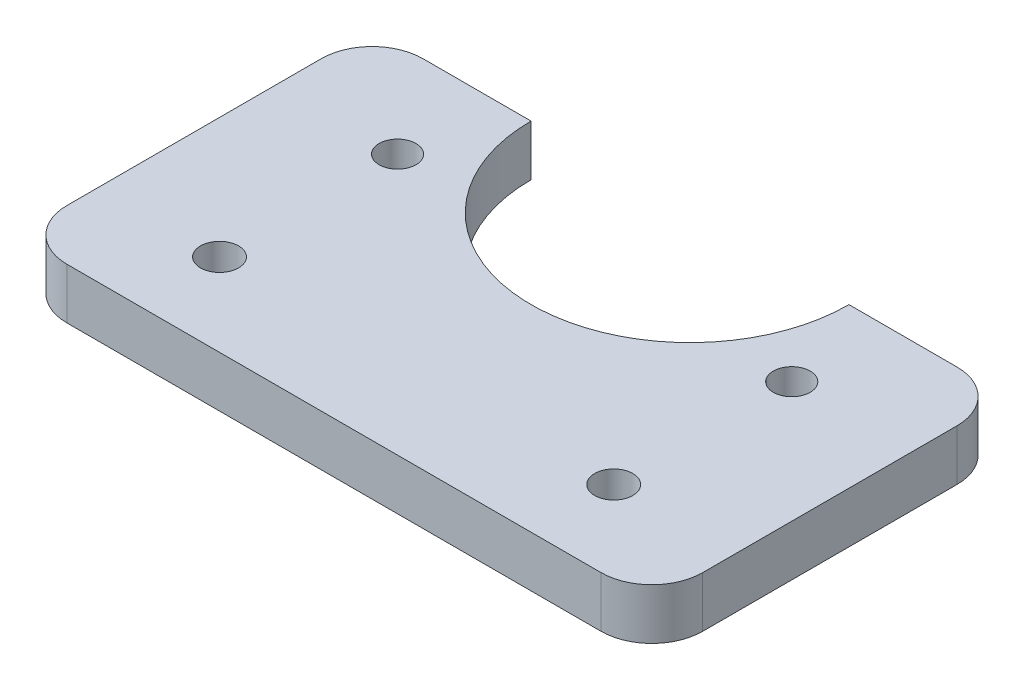
ISO-10303-21;
HEADER;
FILE_DESCRIPTION(('STEP AP214'),'2;1');
FILE_NAME('part.step','',(''),(''),'','','');
FILE_SCHEMA(('AUTOMOTIVE_DESIGN { 1 0 10303 214 1 1 1 1 }'));
ENDSEC;
DATA;
#1=APPLICATION_CONTEXT('core data for automotive mechanical design processes');
#2=APPLICATION_PROTOCOL_DEFINITION('international standard','automotive_design',2000,#1);
#3=PRODUCT_CONTEXT('',#1,'mechanical');
#4=PRODUCT('Part','Part','',(#3));
#5=PRODUCT_RELATED_PRODUCT_CATEGORY('part','',(#4));
#6=PRODUCT_DEFINITION_FORMATION('','',#4);
#7=PRODUCT_DEFINITION_CONTEXT('part definition',#1,'design');
#8=PRODUCT_DEFINITION('design','',#6,#7);
#9=PRODUCT_DEFINITION_SHAPE('','',#8);
#10=(LENGTH_UNIT() NAMED_UNIT(*) SI_UNIT(.MILLI.,.METRE.));
#11=(NAMED_UNIT(*) PLANE_ANGLE_UNIT() SI_UNIT($,.RADIAN.));
#12=(NAMED_UNIT(*) SI_UNIT($,.STERADIAN.) SOLID_ANGLE_UNIT());
#13=UNCERTAINTY_MEASURE_WITH_UNIT(LENGTH_MEASURE(1.E-05),#10,'distance_accuracy_value','');
#14=(GEOMETRIC_REPRESENTATION_CONTEXT(3) GLOBAL_UNCERTAINTY_ASSIGNED_CONTEXT((#13)) GLOBAL_UNIT_ASSIGNED_CONTEXT((#10,
#11,#12)) REPRESENTATION_CONTEXT('',''));
#15=CARTESIAN_POINT('',(0.,0.,0.));
#16=DIRECTION('',(0.,0.,1.));
#17=DIRECTION('',(1.,0.,0.));
#18=AXIS2_PLACEMENT_3D('',#15,#16,#17);
#19=CARTESIAN_POINT('',(-25.,4.,-12.5));
#20=DIRECTION('',(0.,0.,1.));
#21=DIRECTION('',(1.,0.,0.));
#22=AXIS2_PLACEMENT_3D('',#19,#20,#21);
#23=PLANE('',#22);
#24=DIRECTION('',(-1.,0.,0.));
#25=VECTOR('',#24,1.);
#26=CARTESIAN_POINT('',(-25.,4.,-12.5));
#27=LINE('',#26,#25);
#28=CARTESIAN_POINT('',(21.,4.,-12.5));
#29=VERTEX_POINT('',#28);
#30=CARTESIAN_POINT('',(12.5,4.,-12.5));
#31=VERTEX_POINT('',#30);
#32=EDGE_CURVE('E215',#29,#31,#27,.T.);
#33=ORIENTED_EDGE('',*,*,#32,.F.);
#34=DIRECTION('',(0.,-1.,0.));
#35=VECTOR('',#34,1.);
#36=CARTESIAN_POINT('',(21.,4.,-12.5));
#37=LINE('',#36,#35);
#38=CARTESIAN_POINT('',(21.,0.,-12.5));
#39=VERTEX_POINT('',#38);
#40=EDGE_CURVE('E174',#29,#39,#37,.T.);
#41=ORIENTED_EDGE('',*,*,#40,.T.);
#42=DIRECTION('',(-1.,0.,0.));
#43=VECTOR('',#42,1.);
#44=CARTESIAN_POINT('',(-25.,0.,-12.5));
#45=LINE('',#44,#43);
#46=CARTESIAN_POINT('',(12.5,0.,-12.5));
#47=VERTEX_POINT('',#46);
#48=EDGE_CURVE('E143',#39,#47,#45,.T.);
#49=ORIENTED_EDGE('',*,*,#48,.T.);
#50=DIRECTION('',(0.,1.,0.));
#51=VECTOR('',#50,1.);
#52=CARTESIAN_POINT('',(12.5,0.,-12.5));
#53=LINE('',#52,#51);
#54=EDGE_CURVE('E123',#47,#31,#53,.T.);
#55=ORIENTED_EDGE('',*,*,#54,.T.);
#56=EDGE_LOOP('',(#33,#41,#49,#55));
#57=FACE_BOUND('',#56,.T.);
#58=ADVANCED_FACE('F35',(#57),#23,.F.);
#59=CARTESIAN_POINT('',(25.,4.,-12.5));
#60=DIRECTION('',(-1.,0.,0.));
#61=DIRECTION('',(0.,0.,1.));
#62=AXIS2_PLACEMENT_3D('',#59,#60,#61);
#63=PLANE('',#62);
#64=DIRECTION('',(0.,0.,-1.));
#65=VECTOR('',#64,1.);
#66=CARTESIAN_POINT('',(25.,0.,-12.5));
#67=LINE('',#66,#65);
#68=CARTESIAN_POINT('',(25.,0.,11.5));
#69=VERTEX_POINT('',#68);
#70=CARTESIAN_POINT('',(25.,0.,-8.5));
#71=VERTEX_POINT('',#70);
#72=EDGE_CURVE('E144',#69,#71,#67,.T.);
#73=ORIENTED_EDGE('',*,*,#72,.T.);
#74=DIRECTION('',(0.,-1.,0.));
#75=VECTOR('',#74,1.);
#76=CARTESIAN_POINT('',(25.,4.,-8.5));
#77=LINE('',#76,#75);
#78=CARTESIAN_POINT('',(25.,4.,-8.5));
#79=VERTEX_POINT('',#78);
#80=EDGE_CURVE('E60',#71,#79,#77,.F.);
#81=ORIENTED_EDGE('',*,*,#80,.T.);
#82=DIRECTION('',(0.,0.,-1.));
#83=VECTOR('',#82,1.);
#84=CARTESIAN_POINT('',(25.,4.,-12.5));
#85=LINE('',#84,#83);
#86=CARTESIAN_POINT('',(25.,4.,11.5));
#87=VERTEX_POINT('',#86);
#88=EDGE_CURVE('E152',#87,#79,#85,.T.);
#89=ORIENTED_EDGE('',*,*,#88,.F.);
#90=DIRECTION('',(0.,1.,0.));
#91=VECTOR('',#90,1.);
#92=CARTESIAN_POINT('',(25.,0.,11.5));
#93=LINE('',#92,#91);
#94=EDGE_CURVE('E177',#87,#69,#93,.F.);
#95=ORIENTED_EDGE('',*,*,#94,.T.);
#96=EDGE_LOOP('',(#73,#81,#89,#95));
#97=FACE_BOUND('',#96,.T.);
#98=ADVANCED_FACE('F237',(#97),#63,.F.);
#99=CARTESIAN_POINT('',(-12.5,0.,-12.5));
#100=VERTEX_POINT('',#99);
#101=CARTESIAN_POINT('',(-21.,0.,-12.5));
#102=VERTEX_POINT('',#101);
#103=EDGE_CURVE('E134',#100,#102,#45,.T.);
#104=ORIENTED_EDGE('',*,*,#103,.T.);
#105=DIRECTION('',(0.,-1.,0.));
#106=VECTOR('',#105,1.);
#107=CARTESIAN_POINT('',(-21.,4.,-12.5));
#108=LINE('',#107,#106);
#109=CARTESIAN_POINT('',(-21.,4.,-12.5));
#110=VERTEX_POINT('',#109);
#111=EDGE_CURVE('E165',#102,#110,#108,.F.);
#112=ORIENTED_EDGE('',*,*,#111,.T.);
#113=CARTESIAN_POINT('',(-12.5,4.,-12.5));
#114=VERTEX_POINT('',#113);
#115=EDGE_CURVE('E137',#114,#110,#27,.T.);
#116=ORIENTED_EDGE('',*,*,#115,.F.);
#117=DIRECTION('',(0.,1.,0.));
#118=VECTOR('',#117,1.);
#119=CARTESIAN_POINT('',(-12.5,0.,-12.5));
#120=LINE('',#119,#118);
#121=EDGE_CURVE('E120',#114,#100,#120,.F.);
#122=ORIENTED_EDGE('',*,*,#121,.T.);
#123=EDGE_LOOP('',(#104,#112,#116,#122));
#124=FACE_BOUND('',#123,.T.);
#125=ADVANCED_FACE('F133',(#124),#23,.F.);
#126=CARTESIAN_POINT('',(-25.,4.,-12.5));
#127=DIRECTION('',(1.,0.,0.));
#128=DIRECTION('',(0.,0.,-1.));
#129=AXIS2_PLACEMENT_3D('',#126,#127,#128);
#130=PLANE('',#129);
#131=DIRECTION('',(0.,0.,1.));
#132=VECTOR('',#131,1.);
#133=CARTESIAN_POINT('',(-25.,4.,-12.5));
#134=LINE('',#133,#132);
#135=CARTESIAN_POINT('',(-25.,4.,-8.5));
#136=VERTEX_POINT('',#135);
#137=CARTESIAN_POINT('',(-25.,4.,11.5));
#138=VERTEX_POINT('',#137);
#139=EDGE_CURVE('E128',#136,#138,#134,.T.);
#140=ORIENTED_EDGE('',*,*,#139,.F.);
#141=DIRECTION('',(0.,-1.,0.));
#142=VECTOR('',#141,1.);
#143=CARTESIAN_POINT('',(-25.,4.,-8.5));
#144=LINE('',#143,#142);
#145=CARTESIAN_POINT('',(-25.,0.,-8.5));
#146=VERTEX_POINT('',#145);
#147=EDGE_CURVE('E155',#136,#146,#144,.T.);
#148=ORIENTED_EDGE('',*,*,#147,.T.);
#149=DIRECTION('',(0.,0.,1.));
#150=VECTOR('',#149,1.);
#151=CARTESIAN_POINT('',(-25.,0.,-12.5));
#152=LINE('',#151,#150);
#153=CARTESIAN_POINT('',(-25.,0.,11.5));
#154=VERTEX_POINT('',#153);
#155=EDGE_CURVE('E146',#146,#154,#152,.T.);
#156=ORIENTED_EDGE('',*,*,#155,.T.);
#157=DIRECTION('',(0.,-1.,0.));
#158=VECTOR('',#157,1.);
#159=CARTESIAN_POINT('',(-25.,4.,11.5));
#160=LINE('',#159,#158);
#161=EDGE_CURVE('E127',#154,#138,#160,.F.);
#162=ORIENTED_EDGE('',*,*,#161,.T.);
#163=EDGE_LOOP('',(#140,#148,#156,#162));
#164=FACE_BOUND('',#163,.T.);
#165=ADVANCED_FACE('F244',(#164),#130,.F.);
#166=CARTESIAN_POINT('',(0.,4.,0.));
#167=DIRECTION('',(0.,1.,0.));
#168=DIRECTION('',(0.,0.,1.));
#169=AXIS2_PLACEMENT_3D('',#166,#167,#168);
#170=PLANE('',#169);
#171=CARTESIAN_POINT('',(15.5,4.,9.));
#172=DIRECTION('',(0.,1.,0.));
#173=DIRECTION('',(0.,0.,1.));
#174=AXIS2_PLACEMENT_3D('',#171,#172,#173);
#175=CIRCLE('',#174,1.5);
#176=CARTESIAN_POINT('',(15.5,4.,10.5));
#177=VERTEX_POINT('',#176);
#178=EDGE_CURVE('E183',#177,#177,#175,.T.);
#179=ORIENTED_EDGE('',*,*,#178,.F.);
#180=EDGE_LOOP('',(#179));
#181=FACE_BOUND('',#180,.T.);
#182=CARTESIAN_POINT('',(-15.5,4.,9.));
#183=DIRECTION('',(0.,1.,0.));
#184=DIRECTION('',(0.,0.,1.));
#185=AXIS2_PLACEMENT_3D('',#182,#183,#184);
#186=CIRCLE('',#185,1.5);
#187=CARTESIAN_POINT('',(-15.5,4.,10.5));
#188=VERTEX_POINT('',#187);
#189=EDGE_CURVE('E189',#188,#188,#186,.T.);
#190=ORIENTED_EDGE('',*,*,#189,.F.);
#191=EDGE_LOOP('',(#190));
#192=FACE_BOUND('',#191,.T.);
#193=ORIENTED_EDGE('',*,*,#115,.T.);
#194=CARTESIAN_POINT('',(-21.,4.,-8.5));
#195=DIRECTION('',(0.,1.,0.));
#196=DIRECTION('',(0.,0.,1.));
#197=AXIS2_PLACEMENT_3D('',#194,#195,#196);
#198=CIRCLE('',#197,4.);
#199=EDGE_CURVE('E172',#110,#136,#198,.T.);
#200=ORIENTED_EDGE('',*,*,#199,.T.);
#201=ORIENTED_EDGE('',*,*,#139,.T.);
#202=CARTESIAN_POINT('',(-21.,4.,11.5));
#203=DIRECTION('',(0.,1.,0.));
#204=DIRECTION('',(0.,0.,1.));
#205=AXIS2_PLACEMENT_3D('',#202,#203,#204);
#206=CIRCLE('',#205,4.);
#207=CARTESIAN_POINT('',(-21.,4.,15.5));
#208=VERTEX_POINT('',#207);
#209=EDGE_CURVE('E167',#138,#208,#206,.T.);
#210=ORIENTED_EDGE('',*,*,#209,.T.);
#211=DIRECTION('',(-1.,0.,0.));
#212=VECTOR('',#211,1.);
#213=CARTESIAN_POINT('',(25.,4.,15.5));
#214=LINE('',#213,#212);
#215=CARTESIAN_POINT('',(21.,4.,15.5));
#216=VERTEX_POINT('',#215);
#217=EDGE_CURVE('E198',#216,#208,#214,.T.);
#218=ORIENTED_EDGE('',*,*,#217,.F.);
#219=CARTESIAN_POINT('',(21.,4.,11.5));
#220=DIRECTION('',(0.,1.,0.));
#221=DIRECTION('',(0.,0.,1.));
#222=AXIS2_PLACEMENT_3D('',#219,#220,#221);
#223=CIRCLE('',#222,4.);
#224=EDGE_CURVE('E169',#216,#87,#223,.T.);
#225=ORIENTED_EDGE('',*,*,#224,.T.);
#226=ORIENTED_EDGE('',*,*,#88,.T.);
#227=CARTESIAN_POINT('',(21.,4.,-8.5));
#228=DIRECTION('',(0.,1.,0.));
#229=DIRECTION('',(0.,0.,1.));
#230=AXIS2_PLACEMENT_3D('',#227,#228,#229);
#231=CIRCLE('',#230,4.);
#232=EDGE_CURVE('E52',#79,#29,#231,.T.);
#233=ORIENTED_EDGE('',*,*,#232,.T.);
#234=ORIENTED_EDGE('',*,*,#32,.T.);
#235=CARTESIAN_POINT('',(0.,4.,-12.5));
#236=DIRECTION('',(0.,1.,0.));
#237=DIRECTION('',(0.,0.,1.));
#238=AXIS2_PLACEMENT_3D('',#235,#236,#237);
#239=CIRCLE('',#238,12.5);
#240=EDGE_CURVE('E138',#114,#31,#239,.T.);
#241=ORIENTED_EDGE('',*,*,#240,.F.);
#242=EDGE_LOOP('',(#193,#200,#201,#210,#218,#225,#226,#233,#234,#241));
#243=FACE_BOUND('',#242,.T.);
#244=CARTESIAN_POINT('',(-15.5,4.,-5.));
#245=DIRECTION('',(0.,1.,0.));
#246=DIRECTION('',(0.,0.,1.));
#247=AXIS2_PLACEMENT_3D('',#244,#245,#246);
#248=CIRCLE('',#247,1.45);
#249=CARTESIAN_POINT('',(-15.5,4.,-3.55));
#250=VERTEX_POINT('',#249);
#251=EDGE_CURVE('E206',#250,#250,#248,.T.);
#252=ORIENTED_EDGE('',*,*,#251,.F.);
#253=EDGE_LOOP('',(#252));
#254=FACE_BOUND('',#253,.T.);
#255=CARTESIAN_POINT('',(15.5,4.,-5.));
#256=DIRECTION('',(0.,1.,0.));
#257=DIRECTION('',(0.,0.,1.));
#258=AXIS2_PLACEMENT_3D('',#255,#256,#257);
#259=CIRCLE('',#258,1.45);
#260=CARTESIAN_POINT('',(15.5,4.,-3.55));
#261=VERTEX_POINT('',#260);
#262=EDGE_CURVE('E203',#261,#261,#259,.T.);
#263=ORIENTED_EDGE('',*,*,#262,.F.);
#264=EDGE_LOOP('',(#263));
#265=FACE_BOUND('',#264,.T.);
#266=ADVANCED_FACE('F219',(#181,#192,#243,#254,#265),#170,.T.);
#267=CARTESIAN_POINT('',(0.,0.,0.));
#268=DIRECTION('',(0.,1.,0.));
#269=DIRECTION('',(0.,0.,1.));
#270=AXIS2_PLACEMENT_3D('',#267,#268,#269);
#271=PLANE('',#270);
#272=CARTESIAN_POINT('',(15.5,0.,9.));
#273=DIRECTION('',(0.,1.,0.));
#274=DIRECTION('',(0.,0.,1.));
#275=AXIS2_PLACEMENT_3D('',#272,#273,#274);
#276=CIRCLE('',#275,1.5);
#277=CARTESIAN_POINT('',(15.5,0.,10.5));
#278=VERTEX_POINT('',#277);
#279=EDGE_CURVE('E39',#278,#278,#276,.T.);
#280=ORIENTED_EDGE('',*,*,#279,.T.);
#281=EDGE_LOOP('',(#280));
#282=FACE_BOUND('',#281,.T.);
#283=CARTESIAN_POINT('',(-15.5,0.,9.));
#284=DIRECTION('',(0.,1.,0.));
#285=DIRECTION('',(0.,0.,1.));
#286=AXIS2_PLACEMENT_3D('',#283,#284,#285);
#287=CIRCLE('',#286,1.5);
#288=CARTESIAN_POINT('',(-15.5,0.,10.5));
#289=VERTEX_POINT('',#288);
#290=EDGE_CURVE('E181',#289,#289,#287,.T.);
#291=ORIENTED_EDGE('',*,*,#290,.T.);
#292=EDGE_LOOP('',(#291));
#293=FACE_BOUND('',#292,.T.);
#294=CARTESIAN_POINT('',(-15.5,0.,-5.));
#295=DIRECTION('',(0.,1.,0.));
#296=DIRECTION('',(0.,0.,1.));
#297=AXIS2_PLACEMENT_3D('',#294,#295,#296);
#298=CIRCLE('',#297,1.45);
#299=CARTESIAN_POINT('',(-15.5,0.,-3.55));
#300=VERTEX_POINT('',#299);
#301=EDGE_CURVE('E147',#300,#300,#298,.T.);
#302=ORIENTED_EDGE('',*,*,#301,.T.);
#303=EDGE_LOOP('',(#302));
#304=FACE_BOUND('',#303,.T.);
#305=CARTESIAN_POINT('',(15.5,0.,-5.));
#306=DIRECTION('',(0.,1.,0.));
#307=DIRECTION('',(0.,0.,1.));
#308=AXIS2_PLACEMENT_3D('',#305,#306,#307);
#309=CIRCLE('',#308,1.45);
#310=CARTESIAN_POINT('',(15.5,0.,-3.55));
#311=VERTEX_POINT('',#310);
#312=EDGE_CURVE('E209',#311,#311,#309,.T.);
#313=ORIENTED_EDGE('',*,*,#312,.T.);
#314=EDGE_LOOP('',(#313));
#315=FACE_BOUND('',#314,.T.);
#316=ORIENTED_EDGE('',*,*,#155,.F.);
#317=CARTESIAN_POINT('',(-21.,0.,-8.5));
#318=DIRECTION('',(0.,1.,0.));
#319=DIRECTION('',(0.,0.,1.));
#320=AXIS2_PLACEMENT_3D('',#317,#318,#319);
#321=CIRCLE('',#320,4.);
#322=EDGE_CURVE('E142',#146,#102,#321,.F.);
#323=ORIENTED_EDGE('',*,*,#322,.T.);
#324=ORIENTED_EDGE('',*,*,#103,.F.);
#325=CARTESIAN_POINT('',(0.,0.,-12.5));
#326=DIRECTION('',(0.,1.,0.));
#327=DIRECTION('',(0.,0.,1.));
#328=AXIS2_PLACEMENT_3D('',#325,#326,#327);
#329=CIRCLE('',#328,12.5);
#330=EDGE_CURVE('E116',#100,#47,#329,.T.);
#331=ORIENTED_EDGE('',*,*,#330,.T.);
#332=ORIENTED_EDGE('',*,*,#48,.F.);
#333=CARTESIAN_POINT('',(21.,0.,-8.5));
#334=DIRECTION('',(0.,1.,0.));
#335=DIRECTION('',(0.,0.,1.));
#336=AXIS2_PLACEMENT_3D('',#333,#334,#335);
#337=CIRCLE('',#336,4.);
#338=EDGE_CURVE('E162',#39,#71,#337,.F.);
#339=ORIENTED_EDGE('',*,*,#338,.T.);
#340=ORIENTED_EDGE('',*,*,#72,.F.);
#341=CARTESIAN_POINT('',(21.,0.,11.5));
#342=DIRECTION('',(0.,1.,0.));
#343=DIRECTION('',(0.,0.,1.));
#344=AXIS2_PLACEMENT_3D('',#341,#342,#343);
#345=CIRCLE('',#344,4.);
#346=CARTESIAN_POINT('',(21.,0.,15.5));
#347=VERTEX_POINT('',#346);
#348=EDGE_CURVE('E160',#69,#347,#345,.F.);
#349=ORIENTED_EDGE('',*,*,#348,.T.);
#350=DIRECTION('',(1.,0.,0.));
#351=VECTOR('',#350,1.);
#352=CARTESIAN_POINT('',(-25.,0.,15.5));
#353=LINE('',#352,#351);
#354=CARTESIAN_POINT('',(-21.,0.,15.5));
#355=VERTEX_POINT('',#354);
#356=EDGE_CURVE('E187',#355,#347,#353,.T.);
#357=ORIENTED_EDGE('',*,*,#356,.F.);
#358=CARTESIAN_POINT('',(-21.,0.,11.5));
#359=DIRECTION('',(0.,1.,0.));
#360=DIRECTION('',(0.,0.,1.));
#361=AXIS2_PLACEMENT_3D('',#358,#359,#360);
#362=CIRCLE('',#361,4.);
#363=EDGE_CURVE('E158',#355,#154,#362,.F.);
#364=ORIENTED_EDGE('',*,*,#363,.T.);
#365=EDGE_LOOP('',(#316,#323,#324,#331,#332,#339,#340,#349,#357,#364));
#366=FACE_BOUND('',#365,.T.);
#367=ADVANCED_FACE('F141',(#282,#293,#304,#315,#366),#271,.F.);
#368=CARTESIAN_POINT('',(15.5,0.,-5.));
#369=DIRECTION('',(0.,1.,0.));
#370=DIRECTION('',(0.,0.,1.));
#371=AXIS2_PLACEMENT_3D('',#368,#369,#370);
#372=CYLINDRICAL_SURFACE('',#371,1.45);
#373=ORIENTED_EDGE('',*,*,#312,.F.);
#374=EDGE_LOOP('',(#373));
#375=FACE_BOUND('',#374,.T.);
#376=ORIENTED_EDGE('',*,*,#262,.T.);
#377=EDGE_LOOP('',(#376));
#378=FACE_BOUND('',#377,.T.);
#379=ADVANCED_FACE('F288',(#375,#378),#372,.F.);
#380=CARTESIAN_POINT('',(-15.5,0.,-5.));
#381=DIRECTION('',(0.,1.,0.));
#382=DIRECTION('',(0.,0.,1.));
#383=AXIS2_PLACEMENT_3D('',#380,#381,#382);
#384=CYLINDRICAL_SURFACE('',#383,1.45);
#385=ORIENTED_EDGE('',*,*,#301,.F.);
#386=EDGE_LOOP('',(#385));
#387=FACE_BOUND('',#386,.T.);
#388=ORIENTED_EDGE('',*,*,#251,.T.);
#389=EDGE_LOOP('',(#388));
#390=FACE_BOUND('',#389,.T.);
#391=ADVANCED_FACE('F285',(#387,#390),#384,.F.);
#392=CARTESIAN_POINT('',(0.,0.,-12.5));
#393=DIRECTION('',(0.,1.,0.));
#394=DIRECTION('',(0.,0.,1.));
#395=AXIS2_PLACEMENT_3D('',#392,#393,#394);
#396=CYLINDRICAL_SURFACE('',#395,12.5);
#397=ORIENTED_EDGE('',*,*,#330,.F.);
#398=ORIENTED_EDGE('',*,*,#121,.F.);
#399=ORIENTED_EDGE('',*,*,#240,.T.);
#400=ORIENTED_EDGE('',*,*,#54,.F.);
#401=EDGE_LOOP('',(#397,#398,#399,#400));
#402=FACE_BOUND('',#401,.T.);
#403=ADVANCED_FACE('F118',(#402),#396,.F.);
#404=CARTESIAN_POINT('',(0.,0.,15.5));
#405=DIRECTION('',(0.,0.,1.));
#406=DIRECTION('',(1.,0.,0.));
#407=AXIS2_PLACEMENT_3D('',#404,#405,#406);
#408=PLANE('',#407);
#409=ORIENTED_EDGE('',*,*,#356,.T.);
#410=DIRECTION('',(0.,1.,0.));
#411=VECTOR('',#410,1.);
#412=CARTESIAN_POINT('',(21.,4.,15.5));
#413=LINE('',#412,#411);
#414=EDGE_CURVE('E11',#347,#216,#413,.T.);
#415=ORIENTED_EDGE('',*,*,#414,.T.);
#416=ORIENTED_EDGE('',*,*,#217,.T.);
#417=DIRECTION('',(0.,-1.,0.));
#418=VECTOR('',#417,1.);
#419=CARTESIAN_POINT('',(-21.,0.,15.5));
#420=LINE('',#419,#418);
#421=EDGE_CURVE('E44',#208,#355,#420,.T.);
#422=ORIENTED_EDGE('',*,*,#421,.T.);
#423=EDGE_LOOP('',(#409,#415,#416,#422));
#424=FACE_BOUND('',#423,.T.);
#425=ADVANCED_FACE('F230',(#424),#408,.T.);
#426=CARTESIAN_POINT('',(-21.,4.,-8.5));
#427=DIRECTION('',(0.,-1.,0.));
#428=DIRECTION('',(0.,0.,-1.));
#429=AXIS2_PLACEMENT_3D('',#426,#427,#428);
#430=CYLINDRICAL_SURFACE('',#429,4.);
#431=ORIENTED_EDGE('',*,*,#199,.F.);
#432=ORIENTED_EDGE('',*,*,#111,.F.);
#433=ORIENTED_EDGE('',*,*,#322,.F.);
#434=ORIENTED_EDGE('',*,*,#147,.F.);
#435=EDGE_LOOP('',(#431,#432,#433,#434));
#436=FACE_BOUND('',#435,.T.);
#437=ADVANCED_FACE('F243',(#436),#430,.T.);
#438=CARTESIAN_POINT('',(21.,4.,-8.5));
#439=DIRECTION('',(0.,-1.,0.));
#440=DIRECTION('',(0.,0.,-1.));
#441=AXIS2_PLACEMENT_3D('',#438,#439,#440);
#442=CYLINDRICAL_SURFACE('',#441,4.);
#443=ORIENTED_EDGE('',*,*,#232,.F.);
#444=ORIENTED_EDGE('',*,*,#80,.F.);
#445=ORIENTED_EDGE('',*,*,#338,.F.);
#446=ORIENTED_EDGE('',*,*,#40,.F.);
#447=EDGE_LOOP('',(#443,#444,#445,#446));
#448=FACE_BOUND('',#447,.T.);
#449=ADVANCED_FACE('F239',(#448),#442,.T.);
#450=CARTESIAN_POINT('',(21.,0.,11.5));
#451=DIRECTION('',(0.,-1.,0.));
#452=DIRECTION('',(0.,0.,-1.));
#453=AXIS2_PLACEMENT_3D('',#450,#451,#452);
#454=CYLINDRICAL_SURFACE('',#453,4.);
#455=ORIENTED_EDGE('',*,*,#348,.F.);
#456=ORIENTED_EDGE('',*,*,#94,.F.);
#457=ORIENTED_EDGE('',*,*,#224,.F.);
#458=ORIENTED_EDGE('',*,*,#414,.F.);
#459=EDGE_LOOP('',(#455,#456,#457,#458));
#460=FACE_BOUND('',#459,.T.);
#461=ADVANCED_FACE('F236',(#460),#454,.T.);
#462=CARTESIAN_POINT('',(-21.,0.,11.5));
#463=DIRECTION('',(0.,1.,0.));
#464=DIRECTION('',(0.,0.,1.));
#465=AXIS2_PLACEMENT_3D('',#462,#463,#464);
#466=CYLINDRICAL_SURFACE('',#465,4.);
#467=ORIENTED_EDGE('',*,*,#209,.F.);
#468=ORIENTED_EDGE('',*,*,#161,.F.);
#469=ORIENTED_EDGE('',*,*,#363,.F.);
#470=ORIENTED_EDGE('',*,*,#421,.F.);
#471=EDGE_LOOP('',(#467,#468,#469,#470));
#472=FACE_BOUND('',#471,.T.);
#473=ADVANCED_FACE('F37',(#472),#466,.T.);
#474=CARTESIAN_POINT('',(-15.5,-6.,9.));
#475=DIRECTION('',(0.,1.,0.));
#476=DIRECTION('',(0.,0.,1.));
#477=AXIS2_PLACEMENT_3D('',#474,#475,#476);
#478=CYLINDRICAL_SURFACE('',#477,1.5);
#479=ORIENTED_EDGE('',*,*,#189,.T.);
#480=EDGE_LOOP('',(#479));
#481=FACE_BOUND('',#480,.T.);
#482=ORIENTED_EDGE('',*,*,#290,.F.);
#483=EDGE_LOOP('',(#482));
#484=FACE_BOUND('',#483,.T.);
#485=ADVANCED_FACE('F268',(#481,#484),#478,.F.);
#486=CARTESIAN_POINT('',(15.5,-6.,9.));
#487=DIRECTION('',(0.,1.,0.));
#488=DIRECTION('',(0.,0.,1.));
#489=AXIS2_PLACEMENT_3D('',#486,#487,#488);
#490=CYLINDRICAL_SURFACE('',#489,1.5);
#491=ORIENTED_EDGE('',*,*,#178,.T.);
#492=EDGE_LOOP('',(#491));
#493=FACE_BOUND('',#492,.T.);
#494=ORIENTED_EDGE('',*,*,#279,.F.);
#495=EDGE_LOOP('',(#494));
#496=FACE_BOUND('',#495,.T.);
#497=ADVANCED_FACE('F272',(#493,#496),#490,.F.);
#498=CLOSED_SHELL('',(#58,#98,#125,#165,#266,#367,#379,#391,#403,#425,#437,#449,#461,#473,#485,#497));
#499=MANIFOLD_SOLID_BREP('B2',#498);
#500=ADVANCED_BREP_SHAPE_REPRESENTATION('',(#18,#499),#14);
#501=SHAPE_DEFINITION_REPRESENTATION(#9,#500);
ENDSEC;
END-ISO-10303-21;
